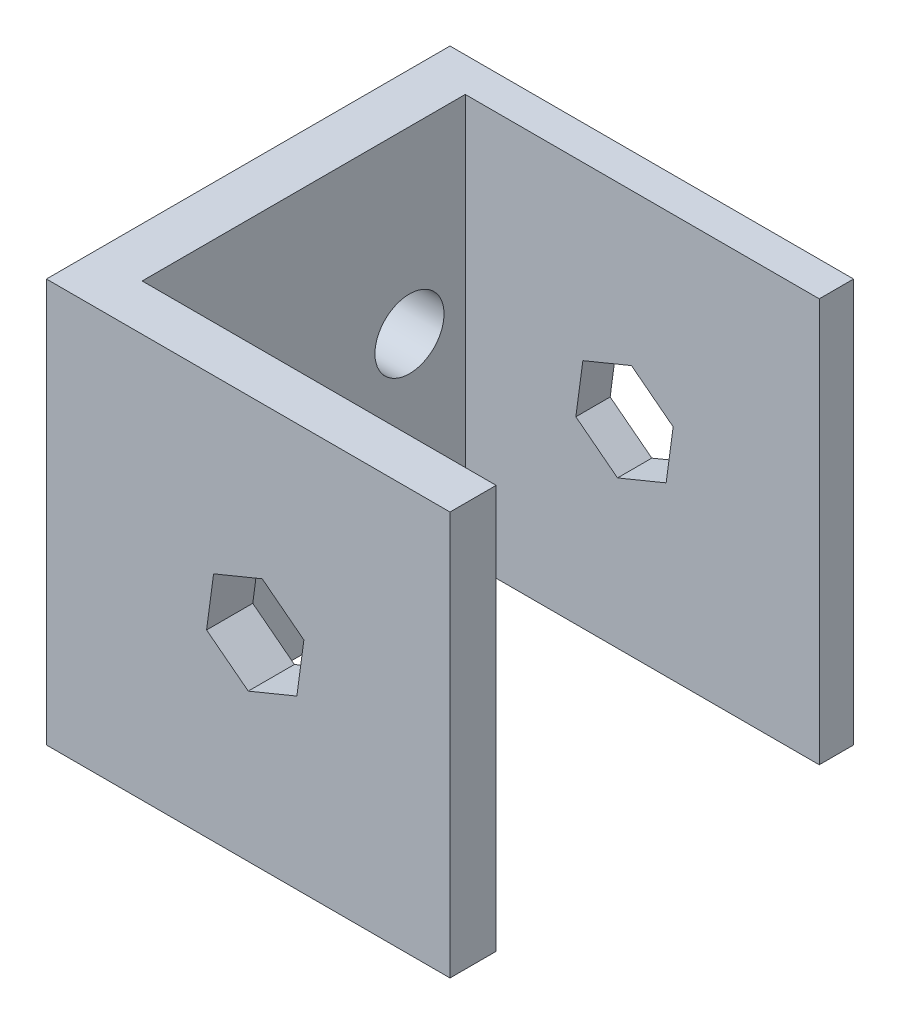
ISO-10303-21;
HEADER;
FILE_DESCRIPTION(('STEP AP214'),'2;1');
FILE_NAME('part.step','',(''),(''),'','','');
FILE_SCHEMA(('AUTOMOTIVE_DESIGN { 1 0 10303 214 1 1 1 1 }'));
ENDSEC;
DATA;
#1=APPLICATION_CONTEXT('core data for automotive mechanical design processes');
#2=APPLICATION_PROTOCOL_DEFINITION('international standard','automotive_design',2000,#1);
#3=PRODUCT_CONTEXT('',#1,'mechanical');
#4=PRODUCT('Part','Part','',(#3));
#5=PRODUCT_RELATED_PRODUCT_CATEGORY('part','',(#4));
#6=PRODUCT_DEFINITION_FORMATION('','',#4);
#7=PRODUCT_DEFINITION_CONTEXT('part definition',#1,'design');
#8=PRODUCT_DEFINITION('design','',#6,#7);
#9=PRODUCT_DEFINITION_SHAPE('','',#8);
#10=(LENGTH_UNIT() NAMED_UNIT(*) SI_UNIT(.MILLI.,.METRE.));
#11=(NAMED_UNIT(*) PLANE_ANGLE_UNIT() SI_UNIT($,.RADIAN.));
#12=(NAMED_UNIT(*) SI_UNIT($,.STERADIAN.) SOLID_ANGLE_UNIT());
#13=UNCERTAINTY_MEASURE_WITH_UNIT(LENGTH_MEASURE(1.E-05),#10,'distance_accuracy_value','');
#14=(GEOMETRIC_REPRESENTATION_CONTEXT(3) GLOBAL_UNCERTAINTY_ASSIGNED_CONTEXT((#13)) GLOBAL_UNIT_ASSIGNED_CONTEXT((#10,
#11,#12)) REPRESENTATION_CONTEXT('',''));
#15=CARTESIAN_POINT('',(0.,0.,0.));
#16=DIRECTION('',(0.,0.,1.));
#17=DIRECTION('',(1.,0.,0.));
#18=AXIS2_PLACEMENT_3D('',#15,#16,#17);
#19=CARTESIAN_POINT('',(0.,100.,0.));
#20=DIRECTION('',(1.,0.,0.));
#21=DIRECTION('',(0.,0.,-1.));
#22=AXIS2_PLACEMENT_3D('',#19,#20,#21);
#23=PLANE('',#22);
#24=CARTESIAN_POINT('',(0.,55.5405643466038,-22.3210604743485));
#25=DIRECTION('',(-1.,0.,0.));
#26=DIRECTION('',(0.,0.,1.));
#27=AXIS2_PLACEMENT_3D('',#24,#25,#26);
#28=CIRCLE('',#27,8.56179105414634);
#29=CARTESIAN_POINT('',(0.,55.5405643466038,-13.7592694202021));
#30=VERTEX_POINT('',#29);
#31=EDGE_CURVE('E332',#30,#30,#28,.T.);
#32=ORIENTED_EDGE('',*,*,#31,.F.);
#33=EDGE_LOOP('',(#32));
#34=FACE_BOUND('',#33,.T.);
#35=DIRECTION('',(0.,0.,1.));
#36=VECTOR('',#35,1.);
#37=CARTESIAN_POINT('',(0.,0.,0.));
#38=LINE('',#37,#36);
#39=CARTESIAN_POINT('',(0.,0.,-100.));
#40=VERTEX_POINT('',#39);
#41=CARTESIAN_POINT('',(0.,0.,0.));
#42=VERTEX_POINT('',#41);
#43=EDGE_CURVE('E272',#40,#42,#38,.T.);
#44=ORIENTED_EDGE('',*,*,#43,.T.);
#45=DIRECTION('',(0.,-1.,0.));
#46=VECTOR('',#45,1.);
#47=CARTESIAN_POINT('',(0.,100.,0.));
#48=LINE('',#47,#46);
#49=CARTESIAN_POINT('',(0.,100.,0.));
#50=VERTEX_POINT('',#49);
#51=EDGE_CURVE('E309',#50,#42,#48,.T.);
#52=ORIENTED_EDGE('',*,*,#51,.F.);
#53=DIRECTION('',(0.,0.,1.));
#54=VECTOR('',#53,1.);
#55=CARTESIAN_POINT('',(0.,100.,0.));
#56=LINE('',#55,#54);
#57=CARTESIAN_POINT('',(0.,100.,-100.));
#58=VERTEX_POINT('',#57);
#59=EDGE_CURVE('E279',#58,#50,#56,.T.);
#60=ORIENTED_EDGE('',*,*,#59,.F.);
#61=DIRECTION('',(0.,-1.,0.));
#62=VECTOR('',#61,1.);
#63=CARTESIAN_POINT('',(0.,100.,-100.));
#64=LINE('',#63,#62);
#65=EDGE_CURVE('E291',#58,#40,#64,.T.);
#66=ORIENTED_EDGE('',*,*,#65,.T.);
#67=EDGE_LOOP('',(#44,#52,#60,#66));
#68=FACE_BOUND('',#67,.T.);
#69=CARTESIAN_POINT('',(0.,55.5405643466038,-77.6789395256516));
#70=DIRECTION('',(-1.,0.,0.));
#71=DIRECTION('',(0.,0.,1.));
#72=AXIS2_PLACEMENT_3D('',#69,#70,#71);
#73=CIRCLE('',#72,8.56179105414634);
#74=CARTESIAN_POINT('',(0.,55.5405643466038,-69.1171484715052));
#75=VERTEX_POINT('',#74);
#76=EDGE_CURVE('E327',#75,#75,#73,.F.);
#77=ORIENTED_EDGE('',*,*,#76,.T.);
#78=EDGE_LOOP('',(#77));
#79=FACE_BOUND('',#78,.T.);
#80=ADVANCED_FACE('F33',(#34,#68,#79),#23,.F.);
#81=CARTESIAN_POINT('',(12.2824612319583,0.,-11.438127000658));
#82=DIRECTION('',(-1.,0.,0.));
#83=DIRECTION('',(0.,0.,1.));
#84=AXIS2_PLACEMENT_3D('',#81,#82,#83);
#85=PLANE('',#84);
#86=CARTESIAN_POINT('',(12.2824612319583,55.5405643466038,-22.3210604743485));
#87=DIRECTION('',(-1.,0.,0.));
#88=DIRECTION('',(0.,0.,1.));
#89=AXIS2_PLACEMENT_3D('',#86,#87,#88);
#90=CIRCLE('',#89,8.56179105414634);
#91=CARTESIAN_POINT('',(12.2824612319583,55.5405643466038,-13.7592694202021));
#92=VERTEX_POINT('',#91);
#93=EDGE_CURVE('E325',#92,#92,#90,.T.);
#94=ORIENTED_EDGE('',*,*,#93,.T.);
#95=EDGE_LOOP('',(#94));
#96=FACE_BOUND('',#95,.T.);
#97=DIRECTION('',(0.,0.,1.));
#98=VECTOR('',#97,1.);
#99=CARTESIAN_POINT('',(12.2824612319583,100.,-11.438127000658));
#100=LINE('',#99,#98);
#101=CARTESIAN_POINT('',(12.2824612319583,100.,-91.4994783761607));
#102=VERTEX_POINT('',#101);
#103=CARTESIAN_POINT('',(12.2824612319583,100.,-11.438127000658));
#104=VERTEX_POINT('',#103);
#105=EDGE_CURVE('E252',#102,#104,#100,.T.);
#106=ORIENTED_EDGE('',*,*,#105,.T.);
#107=DIRECTION('',(0.,1.,0.));
#108=VECTOR('',#107,1.);
#109=CARTESIAN_POINT('',(12.2824612319583,0.,-11.438127000658));
#110=LINE('',#109,#108);
#111=CARTESIAN_POINT('',(12.2824612319583,0.,-11.438127000658));
#112=VERTEX_POINT('',#111);
#113=EDGE_CURVE('E263',#112,#104,#110,.T.);
#114=ORIENTED_EDGE('',*,*,#113,.F.);
#115=DIRECTION('',(0.,0.,1.));
#116=VECTOR('',#115,1.);
#117=CARTESIAN_POINT('',(12.2824612319583,0.,-11.438127000658));
#118=LINE('',#117,#116);
#119=CARTESIAN_POINT('',(12.2824612319583,0.,-91.4994783761607));
#120=VERTEX_POINT('',#119);
#121=EDGE_CURVE('E253',#120,#112,#118,.T.);
#122=ORIENTED_EDGE('',*,*,#121,.F.);
#123=DIRECTION('',(0.,1.,0.));
#124=VECTOR('',#123,1.);
#125=CARTESIAN_POINT('',(12.2824612319583,0.,-91.4994783761607));
#126=LINE('',#125,#124);
#127=EDGE_CURVE('E270',#120,#102,#126,.T.);
#128=ORIENTED_EDGE('',*,*,#127,.T.);
#129=EDGE_LOOP('',(#106,#114,#122,#128));
#130=FACE_BOUND('',#129,.T.);
#131=CARTESIAN_POINT('',(12.2824612319583,55.5405643466038,-77.6789395256516));
#132=DIRECTION('',(-1.,0.,0.));
#133=DIRECTION('',(0.,0.,1.));
#134=AXIS2_PLACEMENT_3D('',#131,#132,#133);
#135=CIRCLE('',#134,8.56179105414634);
#136=CARTESIAN_POINT('',(12.2824612319583,55.5405643466038,-69.1171484715052));
#137=VERTEX_POINT('',#136);
#138=EDGE_CURVE('E36',#137,#137,#135,.F.);
#139=ORIENTED_EDGE('',*,*,#138,.F.);
#140=EDGE_LOOP('',(#139));
#141=FACE_BOUND('',#140,.T.);
#142=ADVANCED_FACE('F345',(#96,#130,#141),#85,.F.);
#143=CARTESIAN_POINT('',(100.,100.,0.));
#144=DIRECTION('',(-1.,0.,0.));
#145=DIRECTION('',(0.,0.,1.));
#146=AXIS2_PLACEMENT_3D('',#143,#144,#145);
#147=PLANE('',#146);
#148=DIRECTION('',(0.,0.,-1.));
#149=VECTOR('',#148,1.);
#150=CARTESIAN_POINT('',(100.,100.,0.));
#151=LINE('',#150,#149);
#152=CARTESIAN_POINT('',(100.,100.,-91.4994783761607));
#153=VERTEX_POINT('',#152);
#154=CARTESIAN_POINT('',(100.,100.,-100.));
#155=VERTEX_POINT('',#154);
#156=EDGE_CURVE('E285',#153,#155,#151,.T.);
#157=ORIENTED_EDGE('',*,*,#156,.F.);
#158=DIRECTION('',(0.,1.,0.));
#159=VECTOR('',#158,1.);
#160=CARTESIAN_POINT('',(100.,0.,-91.4994783761607));
#161=LINE('',#160,#159);
#162=CARTESIAN_POINT('',(100.,0.,-91.4994783761607));
#163=VERTEX_POINT('',#162);
#164=EDGE_CURVE('E273',#163,#153,#161,.T.);
#165=ORIENTED_EDGE('',*,*,#164,.F.);
#166=DIRECTION('',(0.,0.,-1.));
#167=VECTOR('',#166,1.);
#168=CARTESIAN_POINT('',(100.,0.,0.));
#169=LINE('',#168,#167);
#170=CARTESIAN_POINT('',(100.,0.,-100.));
#171=VERTEX_POINT('',#170);
#172=EDGE_CURVE('E296',#163,#171,#169,.T.);
#173=ORIENTED_EDGE('',*,*,#172,.T.);
#174=DIRECTION('',(0.,-1.,0.));
#175=VECTOR('',#174,1.);
#176=CARTESIAN_POINT('',(100.,100.,-100.));
#177=LINE('',#176,#175);
#178=EDGE_CURVE('E303',#155,#171,#177,.T.);
#179=ORIENTED_EDGE('',*,*,#178,.F.);
#180=EDGE_LOOP('',(#157,#165,#173,#179));
#181=FACE_BOUND('',#180,.T.);
#182=ADVANCED_FACE('F367',(#181),#147,.F.);
#183=CARTESIAN_POINT('',(0.,100.,0.));
#184=DIRECTION('',(0.,0.,-1.));
#185=DIRECTION('',(-1.,0.,0.));
#186=AXIS2_PLACEMENT_3D('',#183,#184,#185);
#187=PLANE('',#186);
#188=DIRECTION('',(-0.92474219122438,-0.380594114207684,0.));
#189=VECTOR('',#188,1.);
#190=CARTESIAN_POINT('',(29.5686627879516,28.1560355313738,0.));
#191=LINE('',#190,#189);
#192=CARTESIAN_POINT('',(62.0592826698266,41.5281286524071,0.));
#193=VERTEX_POINT('',#192);
#194=CARTESIAN_POINT('',(50.007786746489,36.568120923391,0.));
#195=VERTEX_POINT('',#194);
#196=EDGE_CURVE('E243',#193,#195,#191,.T.);
#197=ORIENTED_EDGE('',*,*,#196,.T.);
#198=DIRECTION('',(-0.791975267046881,0.610553172447758,0.));
#199=VECTOR('',#198,1.);
#200=CARTESIAN_POINT('',(-12.0303803274629,84.3948666513018,0.));
#201=LINE('',#200,#199);
#202=CARTESIAN_POINT('',(39.6865460885252,44.5250186820979,0.));
#203=VERTEX_POINT('',#202);
#204=EDGE_CURVE('E249',#195,#203,#201,.T.);
#205=ORIENTED_EDGE('',*,*,#204,.T.);
#206=DIRECTION('',(0.132766924177499,0.991147286655443,0.));
#207=VECTOR('',#206,1.);
#208=CARTESIAN_POINT('',(46.2870293685941,93.7997242172564,0.));
#209=LINE('',#208,#207);
#210=CARTESIAN_POINT('',(41.4168013538989,57.4419241698209,0.));
#211=VERTEX_POINT('',#210);
#212=EDGE_CURVE('E221',#203,#211,#209,.T.);
#213=ORIENTED_EDGE('',*,*,#212,.T.);
#214=DIRECTION('',(0.92474219122438,0.380594114207685,0.));
#215=VECTOR('',#214,1.);
#216=CARTESIAN_POINT('',(20.9776773953615,49.0298387778036,0.));
#217=LINE('',#216,#215);
#218=CARTESIAN_POINT('',(53.4682972772364,62.4019318988369,0.));
#219=VERTEX_POINT('',#218);
#220=EDGE_CURVE('E225',#211,#219,#217,.T.);
#221=ORIENTED_EDGE('',*,*,#220,.T.);
#222=DIRECTION('',(0.791975267046881,-0.610553172447758,0.));
#223=VECTOR('',#222,1.);
#224=CARTESIAN_POINT('',(1.75137086124833,102.271779868041,0.));
#225=LINE('',#224,#223);
#226=CARTESIAN_POINT('',(63.7895379352003,54.44503414013,0.));
#227=VERTEX_POINT('',#226);
#228=EDGE_CURVE('E231',#219,#227,#225,.T.);
#229=ORIENTED_EDGE('',*,*,#228,.T.);
#230=DIRECTION('',(-0.1327669241775,-0.991147286655443,0.));
#231=VECTOR('',#230,1.);
#232=CARTESIAN_POINT('',(68.6597659498956,90.8028341875655,0.));
#233=LINE('',#232,#231);
#234=EDGE_CURVE('E237',#227,#193,#233,.T.);
#235=ORIENTED_EDGE('',*,*,#234,.T.);
#236=EDGE_LOOP('',(#197,#205,#213,#221,#229,#235));
#237=FACE_BOUND('',#236,.T.);
#238=DIRECTION('',(1.,0.,0.));
#239=VECTOR('',#238,1.);
#240=CARTESIAN_POINT('',(0.,0.,0.));
#241=LINE('',#240,#239);
#242=CARTESIAN_POINT('',(100.,0.,0.));
#243=VERTEX_POINT('',#242);
#244=EDGE_CURVE('E294',#42,#243,#241,.T.);
#245=ORIENTED_EDGE('',*,*,#244,.T.);
#246=DIRECTION('',(0.,-1.,0.));
#247=VECTOR('',#246,1.);
#248=CARTESIAN_POINT('',(100.,100.,0.));
#249=LINE('',#248,#247);
#250=CARTESIAN_POINT('',(100.,100.,0.));
#251=VERTEX_POINT('',#250);
#252=EDGE_CURVE('E306',#251,#243,#249,.T.);
#253=ORIENTED_EDGE('',*,*,#252,.F.);
#254=DIRECTION('',(1.,0.,0.));
#255=VECTOR('',#254,1.);
#256=CARTESIAN_POINT('',(0.,100.,0.));
#257=LINE('',#256,#255);
#258=EDGE_CURVE('E282',#50,#251,#257,.T.);
#259=ORIENTED_EDGE('',*,*,#258,.F.);
#260=ORIENTED_EDGE('',*,*,#51,.T.);
#261=EDGE_LOOP('',(#245,#253,#259,#260));
#262=FACE_BOUND('',#261,.T.);
#263=ADVANCED_FACE('F357',(#237,#262),#187,.F.);
#264=CARTESIAN_POINT('',(100.,0.,-11.438127000658));
#265=VERTEX_POINT('',#264);
#266=EDGE_CURVE('E297',#243,#265,#169,.T.);
#267=ORIENTED_EDGE('',*,*,#266,.T.);
#268=DIRECTION('',(0.,1.,0.));
#269=VECTOR('',#268,1.);
#270=CARTESIAN_POINT('',(100.,0.,-11.438127000658));
#271=LINE('',#270,#269);
#272=CARTESIAN_POINT('',(100.,100.,-11.438127000658));
#273=VERTEX_POINT('',#272);
#274=EDGE_CURVE('E275',#265,#273,#271,.T.);
#275=ORIENTED_EDGE('',*,*,#274,.T.);
#276=EDGE_CURVE('E286',#251,#273,#151,.T.);
#277=ORIENTED_EDGE('',*,*,#276,.F.);
#278=ORIENTED_EDGE('',*,*,#252,.T.);
#279=EDGE_LOOP('',(#267,#275,#277,#278));
#280=FACE_BOUND('',#279,.T.);
#281=ADVANCED_FACE('F379',(#280),#147,.F.);
#282=CARTESIAN_POINT('',(0.,100.,-100.));
#283=DIRECTION('',(0.,0.,1.));
#284=DIRECTION('',(1.,0.,0.));
#285=AXIS2_PLACEMENT_3D('',#282,#283,#284);
#286=PLANE('',#285);
#287=DIRECTION('',(0.132766924177499,0.991147286655442,0.));
#288=VECTOR('',#287,1.);
#289=CARTESIAN_POINT('',(39.6865460885252,44.5250186820979,-100.));
#290=LINE('',#289,#288);
#291=CARTESIAN_POINT('',(39.6865460885252,44.5250186820979,-100.));
#292=VERTEX_POINT('',#291);
#293=CARTESIAN_POINT('',(41.4168013538989,57.4419241698209,-100.));
#294=VERTEX_POINT('',#293);
#295=EDGE_CURVE('E186',#292,#294,#290,.T.);
#296=ORIENTED_EDGE('',*,*,#295,.F.);
#297=DIRECTION('',(-0.791975267046881,0.610553172447758,0.));
#298=VECTOR('',#297,1.);
#299=CARTESIAN_POINT('',(50.007786746489,36.568120923391,-100.));
#300=LINE('',#299,#298);
#301=CARTESIAN_POINT('',(50.007786746489,36.568120923391,-100.));
#302=VERTEX_POINT('',#301);
#303=EDGE_CURVE('E57',#302,#292,#300,.T.);
#304=ORIENTED_EDGE('',*,*,#303,.F.);
#305=DIRECTION('',(-0.92474219122438,-0.380594114207684,0.));
#306=VECTOR('',#305,1.);
#307=CARTESIAN_POINT('',(62.0592826698266,41.5281286524071,-100.));
#308=LINE('',#307,#306);
#309=CARTESIAN_POINT('',(62.0592826698266,41.5281286524071,-100.));
#310=VERTEX_POINT('',#309);
#311=EDGE_CURVE('E203',#310,#302,#308,.T.);
#312=ORIENTED_EDGE('',*,*,#311,.F.);
#313=DIRECTION('',(-0.1327669241775,-0.991147286655442,0.));
#314=VECTOR('',#313,1.);
#315=CARTESIAN_POINT('',(63.7895379352003,54.44503414013,-100.));
#316=LINE('',#315,#314);
#317=CARTESIAN_POINT('',(63.7895379352003,54.44503414013,-100.));
#318=VERTEX_POINT('',#317);
#319=EDGE_CURVE('E197',#318,#310,#316,.T.);
#320=ORIENTED_EDGE('',*,*,#319,.F.);
#321=DIRECTION('',(0.791975267046881,-0.610553172447758,0.));
#322=VECTOR('',#321,1.);
#323=CARTESIAN_POINT('',(53.4682972772364,62.4019318988369,-100.));
#324=LINE('',#323,#322);
#325=CARTESIAN_POINT('',(53.4682972772364,62.4019318988369,-100.));
#326=VERTEX_POINT('',#325);
#327=EDGE_CURVE('E195',#326,#318,#324,.T.);
#328=ORIENTED_EDGE('',*,*,#327,.F.);
#329=DIRECTION('',(0.92474219122438,0.380594114207685,0.));
#330=VECTOR('',#329,1.);
#331=CARTESIAN_POINT('',(41.4168013538989,57.4419241698209,-100.));
#332=LINE('',#331,#330);
#333=EDGE_CURVE('E177',#294,#326,#332,.T.);
#334=ORIENTED_EDGE('',*,*,#333,.F.);
#335=EDGE_LOOP('',(#296,#304,#312,#320,#328,#334));
#336=FACE_BOUND('',#335,.T.);
#337=DIRECTION('',(-1.,0.,0.));
#338=VECTOR('',#337,1.);
#339=CARTESIAN_POINT('',(0.,0.,-100.));
#340=LINE('',#339,#338);
#341=EDGE_CURVE('E283',#171,#40,#340,.T.);
#342=ORIENTED_EDGE('',*,*,#341,.T.);
#343=ORIENTED_EDGE('',*,*,#65,.F.);
#344=DIRECTION('',(-1.,0.,0.));
#345=VECTOR('',#344,1.);
#346=CARTESIAN_POINT('',(0.,100.,-100.));
#347=LINE('',#346,#345);
#348=EDGE_CURVE('E289',#155,#58,#347,.T.);
#349=ORIENTED_EDGE('',*,*,#348,.F.);
#350=ORIENTED_EDGE('',*,*,#178,.T.);
#351=EDGE_LOOP('',(#342,#343,#349,#350));
#352=FACE_BOUND('',#351,.T.);
#353=ADVANCED_FACE('F191',(#336,#352),#286,.F.);
#354=CARTESIAN_POINT('',(0.,100.,0.));
#355=DIRECTION('',(0.,-1.,0.));
#356=DIRECTION('',(0.,0.,-1.));
#357=AXIS2_PLACEMENT_3D('',#354,#355,#356);
#358=PLANE('',#357);
#359=ORIENTED_EDGE('',*,*,#105,.F.);
#360=DIRECTION('',(-1.,0.,0.));
#361=VECTOR('',#360,1.);
#362=CARTESIAN_POINT('',(12.2824612319583,100.,-91.4994783761607));
#363=LINE('',#362,#361);
#364=EDGE_CURVE('E257',#153,#102,#363,.T.);
#365=ORIENTED_EDGE('',*,*,#364,.F.);
#366=ORIENTED_EDGE('',*,*,#156,.T.);
#367=ORIENTED_EDGE('',*,*,#348,.T.);
#368=ORIENTED_EDGE('',*,*,#59,.T.);
#369=ORIENTED_EDGE('',*,*,#258,.T.);
#370=ORIENTED_EDGE('',*,*,#276,.T.);
#371=DIRECTION('',(1.,0.,0.));
#372=VECTOR('',#371,1.);
#373=CARTESIAN_POINT('',(12.2824612319583,100.,-11.438127000658));
#374=LINE('',#373,#372);
#375=EDGE_CURVE('E266',#104,#273,#374,.T.);
#376=ORIENTED_EDGE('',*,*,#375,.F.);
#377=EDGE_LOOP('',(#359,#365,#366,#367,#368,#369,#370,#376));
#378=FACE_BOUND('',#377,.T.);
#379=ADVANCED_FACE('F361',(#378),#358,.F.);
#380=CARTESIAN_POINT('',(0.,0.,0.));
#381=DIRECTION('',(0.,-1.,0.));
#382=DIRECTION('',(0.,0.,-1.));
#383=AXIS2_PLACEMENT_3D('',#380,#381,#382);
#384=PLANE('',#383);
#385=DIRECTION('',(-1.,0.,0.));
#386=VECTOR('',#385,1.);
#387=CARTESIAN_POINT('',(12.2824612319583,0.,-91.4994783761607));
#388=LINE('',#387,#386);
#389=EDGE_CURVE('E260',#163,#120,#388,.T.);
#390=ORIENTED_EDGE('',*,*,#389,.T.);
#391=ORIENTED_EDGE('',*,*,#121,.T.);
#392=DIRECTION('',(1.,0.,0.));
#393=VECTOR('',#392,1.);
#394=CARTESIAN_POINT('',(12.2824612319583,0.,-11.438127000658));
#395=LINE('',#394,#393);
#396=EDGE_CURVE('E256',#112,#265,#395,.T.);
#397=ORIENTED_EDGE('',*,*,#396,.T.);
#398=ORIENTED_EDGE('',*,*,#266,.F.);
#399=ORIENTED_EDGE('',*,*,#244,.F.);
#400=ORIENTED_EDGE('',*,*,#43,.F.);
#401=ORIENTED_EDGE('',*,*,#341,.F.);
#402=ORIENTED_EDGE('',*,*,#172,.F.);
#403=EDGE_LOOP('',(#390,#391,#397,#398,#399,#400,#401,#402));
#404=FACE_BOUND('',#403,.T.);
#405=ADVANCED_FACE('F352',(#404),#384,.T.);
#406=CARTESIAN_POINT('',(12.2824612319583,0.,-91.4994783761607));
#407=DIRECTION('',(0.,0.,-1.));
#408=DIRECTION('',(-1.,0.,0.));
#409=AXIS2_PLACEMENT_3D('',#406,#407,#408);
#410=PLANE('',#409);
#411=DIRECTION('',(-0.92474219122438,-0.380594114207684,0.));
#412=VECTOR('',#411,1.);
#413=CARTESIAN_POINT('',(4.87684290831273,17.9936774120538,-91.4994783761607));
#414=LINE('',#413,#412);
#415=CARTESIAN_POINT('',(62.0592826698266,41.5281286524071,-91.4994783761607));
#416=VERTEX_POINT('',#415);
#417=CARTESIAN_POINT('',(50.007786746489,36.568120923391,-91.4994783761607));
#418=VERTEX_POINT('',#417);
#419=EDGE_CURVE('E240',#416,#418,#414,.T.);
#420=ORIENTED_EDGE('',*,*,#419,.T.);
#421=DIRECTION('',(-0.791975267046881,0.610553172447758,0.));
#422=VECTOR('',#421,1.);
#423=CARTESIAN_POINT('',(44.027785431861,41.1782507163354,-91.4994783761607));
#424=LINE('',#423,#422);
#425=CARTESIAN_POINT('',(39.6865460885252,44.5250186820979,-91.4994783761607));
#426=VERTEX_POINT('',#425);
#427=EDGE_CURVE('E246',#418,#426,#424,.T.);
#428=ORIENTED_EDGE('',*,*,#427,.T.);
#429=DIRECTION('',(0.132766924177499,0.991147286655443,0.));
#430=VECTOR('',#429,1.);
#431=CARTESIAN_POINT('',(33.3443753368465,-2.82130172845724,-91.4994783761607));
#432=LINE('',#431,#430);
#433=CARTESIAN_POINT('',(41.4168013538989,57.4419241698209,-91.4994783761607));
#434=VERTEX_POINT('',#433);
#435=EDGE_CURVE('E219',#426,#434,#432,.T.);
#436=ORIENTED_EDGE('',*,*,#435,.T.);
#437=DIRECTION('',(0.92474219122438,0.380594114207685,0.));
#438=VECTOR('',#437,1.);
#439=CARTESIAN_POINT('',(-3.71414248427743,38.8674806584836,-91.4994783761607));
#440=LINE('',#439,#438);
#441=CARTESIAN_POINT('',(53.4682972772364,62.4019318988369,-91.4994783761607));
#442=VERTEX_POINT('',#441);
#443=EDGE_CURVE('E180',#434,#442,#440,.T.);
#444=ORIENTED_EDGE('',*,*,#443,.T.);
#445=DIRECTION('',(0.791975267046881,-0.610553172447758,0.));
#446=VECTOR('',#445,1.);
#447=CARTESIAN_POINT('',(57.8095366205723,59.0551639330744,-91.4994783761607));
#448=LINE('',#447,#446);
#449=CARTESIAN_POINT('',(63.7895379352003,54.44503414013,-91.4994783761607));
#450=VERTEX_POINT('',#449);
#451=EDGE_CURVE('E228',#442,#450,#448,.T.);
#452=ORIENTED_EDGE('',*,*,#451,.T.);
#453=DIRECTION('',(-0.1327669241775,-0.991147286655443,0.));
#454=VECTOR('',#453,1.);
#455=CARTESIAN_POINT('',(55.7171119181479,-5.81819175814808,-91.4994783761607));
#456=LINE('',#455,#454);
#457=EDGE_CURVE('E234',#450,#416,#456,.T.);
#458=ORIENTED_EDGE('',*,*,#457,.T.);
#459=EDGE_LOOP('',(#420,#428,#436,#444,#452,#458));
#460=FACE_BOUND('',#459,.T.);
#461=ORIENTED_EDGE('',*,*,#364,.T.);
#462=ORIENTED_EDGE('',*,*,#127,.F.);
#463=ORIENTED_EDGE('',*,*,#389,.F.);
#464=ORIENTED_EDGE('',*,*,#164,.T.);
#465=EDGE_LOOP('',(#461,#462,#463,#464));
#466=FACE_BOUND('',#465,.T.);
#467=ADVANCED_FACE('F371',(#460,#466),#410,.F.);
#468=CARTESIAN_POINT('',(12.2824612319583,0.,-11.438127000658));
#469=DIRECTION('',(0.,0.,1.));
#470=DIRECTION('',(1.,0.,0.));
#471=AXIS2_PLACEMENT_3D('',#468,#469,#470);
#472=PLANE('',#471);
#473=DIRECTION('',(-0.132766924177499,-0.991147286655443,0.));
#474=VECTOR('',#473,1.);
#475=CARTESIAN_POINT('',(33.3443753368465,-2.82130172845724,-11.438127000658));
#476=LINE('',#475,#474);
#477=CARTESIAN_POINT('',(41.4168013538989,57.4419241698209,-11.438127000658));
#478=VERTEX_POINT('',#477);
#479=CARTESIAN_POINT('',(39.6865460885252,44.5250186820979,-11.438127000658));
#480=VERTEX_POINT('',#479);
#481=EDGE_CURVE('E312',#478,#480,#476,.T.);
#482=ORIENTED_EDGE('',*,*,#481,.T.);
#483=DIRECTION('',(0.791975267046881,-0.610553172447758,0.));
#484=VECTOR('',#483,1.);
#485=CARTESIAN_POINT('',(44.027785431861,41.1782507163354,-11.438127000658));
#486=LINE('',#485,#484);
#487=CARTESIAN_POINT('',(50.007786746489,36.568120923391,-11.438127000658));
#488=VERTEX_POINT('',#487);
#489=EDGE_CURVE('E11',#480,#488,#486,.T.);
#490=ORIENTED_EDGE('',*,*,#489,.T.);
#491=DIRECTION('',(0.92474219122438,0.380594114207684,0.));
#492=VECTOR('',#491,1.);
#493=CARTESIAN_POINT('',(4.87684290831273,17.9936774120538,-11.438127000658));
#494=LINE('',#493,#492);
#495=CARTESIAN_POINT('',(62.0592826698266,41.5281286524071,-11.438127000658));
#496=VERTEX_POINT('',#495);
#497=EDGE_CURVE('E41',#488,#496,#494,.T.);
#498=ORIENTED_EDGE('',*,*,#497,.T.);
#499=DIRECTION('',(0.1327669241775,0.991147286655443,0.));
#500=VECTOR('',#499,1.);
#501=CARTESIAN_POINT('',(55.7171119181479,-5.81819175814808,-11.438127000658));
#502=LINE('',#501,#500);
#503=CARTESIAN_POINT('',(63.7895379352003,54.44503414013,-11.438127000658));
#504=VERTEX_POINT('',#503);
#505=EDGE_CURVE('E321',#496,#504,#502,.T.);
#506=ORIENTED_EDGE('',*,*,#505,.T.);
#507=DIRECTION('',(-0.791975267046881,0.610553172447758,0.));
#508=VECTOR('',#507,1.);
#509=CARTESIAN_POINT('',(57.8095366205723,59.0551639330744,-11.438127000658));
#510=LINE('',#509,#508);
#511=CARTESIAN_POINT('',(53.4682972772364,62.4019318988369,-11.438127000658));
#512=VERTEX_POINT('',#511);
#513=EDGE_CURVE('E318',#504,#512,#510,.T.);
#514=ORIENTED_EDGE('',*,*,#513,.T.);
#515=DIRECTION('',(-0.92474219122438,-0.380594114207685,0.));
#516=VECTOR('',#515,1.);
#517=CARTESIAN_POINT('',(-3.71414248427743,38.8674806584836,-11.438127000658));
#518=LINE('',#517,#516);
#519=EDGE_CURVE('E315',#512,#478,#518,.T.);
#520=ORIENTED_EDGE('',*,*,#519,.T.);
#521=EDGE_LOOP('',(#482,#490,#498,#506,#514,#520));
#522=FACE_BOUND('',#521,.T.);
#523=ORIENTED_EDGE('',*,*,#375,.T.);
#524=ORIENTED_EDGE('',*,*,#274,.F.);
#525=ORIENTED_EDGE('',*,*,#396,.F.);
#526=ORIENTED_EDGE('',*,*,#113,.T.);
#527=EDGE_LOOP('',(#523,#524,#525,#526));
#528=FACE_BOUND('',#527,.T.);
#529=ADVANCED_FACE('F377',(#522,#528),#472,.F.);
#530=CARTESIAN_POINT('',(39.6865460885252,44.5250186820979,9.99999999999999));
#531=DIRECTION('',(-0.991147286655443,0.132766924177499,0.));
#532=DIRECTION('',(-0.132766924177499,-0.991147286655443,0.));
#533=AXIS2_PLACEMENT_3D('',#530,#531,#532);
#534=PLANE('',#533);
#535=DIRECTION('',(0.,0.,-1.));
#536=VECTOR('',#535,1.);
#537=CARTESIAN_POINT('',(39.6865460885252,44.5250186820979,9.99999999999999));
#538=LINE('',#537,#536);
#539=EDGE_CURVE('E183',#203,#480,#538,.T.);
#540=ORIENTED_EDGE('',*,*,#539,.T.);
#541=ORIENTED_EDGE('',*,*,#481,.F.);
#542=DIRECTION('',(0.,0.,-1.));
#543=VECTOR('',#542,1.);
#544=CARTESIAN_POINT('',(41.4168013538989,57.4419241698209,9.99999999999999));
#545=LINE('',#544,#543);
#546=EDGE_CURVE('E49',#211,#478,#545,.T.);
#547=ORIENTED_EDGE('',*,*,#546,.F.);
#548=ORIENTED_EDGE('',*,*,#212,.F.);
#549=EDGE_LOOP('',(#540,#541,#547,#548));
#550=FACE_BOUND('',#549,.T.);
#551=ADVANCED_FACE('F408',(#550),#534,.F.);
#552=CARTESIAN_POINT('',(41.4168013538989,57.4419241698209,9.99999999999999));
#553=DIRECTION('',(-0.380594114207685,0.92474219122438,0.));
#554=DIRECTION('',(-0.92474219122438,-0.380594114207685,0.));
#555=AXIS2_PLACEMENT_3D('',#552,#553,#554);
#556=PLANE('',#555);
#557=ORIENTED_EDGE('',*,*,#546,.T.);
#558=ORIENTED_EDGE('',*,*,#519,.F.);
#559=DIRECTION('',(0.,0.,-1.));
#560=VECTOR('',#559,1.);
#561=CARTESIAN_POINT('',(53.4682972772364,62.4019318988369,9.99999999999999));
#562=LINE('',#561,#560);
#563=EDGE_CURVE('E215',#219,#512,#562,.T.);
#564=ORIENTED_EDGE('',*,*,#563,.F.);
#565=ORIENTED_EDGE('',*,*,#220,.F.);
#566=EDGE_LOOP('',(#557,#558,#564,#565));
#567=FACE_BOUND('',#566,.T.);
#568=ADVANCED_FACE('F419',(#567),#556,.F.);
#569=CARTESIAN_POINT('',(53.4682972772364,62.4019318988369,9.99999999999999));
#570=DIRECTION('',(0.610553172447758,0.791975267046881,0.));
#571=DIRECTION('',(-0.791975267046881,0.610553172447758,0.));
#572=AXIS2_PLACEMENT_3D('',#569,#570,#571);
#573=PLANE('',#572);
#574=ORIENTED_EDGE('',*,*,#563,.T.);
#575=ORIENTED_EDGE('',*,*,#513,.F.);
#576=DIRECTION('',(0.,0.,-1.));
#577=VECTOR('',#576,1.);
#578=CARTESIAN_POINT('',(63.7895379352003,54.44503414013,9.99999999999999));
#579=LINE('',#578,#577);
#580=EDGE_CURVE('E212',#227,#504,#579,.T.);
#581=ORIENTED_EDGE('',*,*,#580,.F.);
#582=ORIENTED_EDGE('',*,*,#228,.F.);
#583=EDGE_LOOP('',(#574,#575,#581,#582));
#584=FACE_BOUND('',#583,.T.);
#585=ADVANCED_FACE('F422',(#584),#573,.F.);
#586=CARTESIAN_POINT('',(63.7895379352003,54.44503414013,9.99999999999999));
#587=DIRECTION('',(0.991147286655443,-0.1327669241775,0.));
#588=DIRECTION('',(0.1327669241775,0.991147286655443,0.));
#589=AXIS2_PLACEMENT_3D('',#586,#587,#588);
#590=PLANE('',#589);
#591=ORIENTED_EDGE('',*,*,#580,.T.);
#592=ORIENTED_EDGE('',*,*,#505,.F.);
#593=DIRECTION('',(0.,0.,-1.));
#594=VECTOR('',#593,1.);
#595=CARTESIAN_POINT('',(62.0592826698266,41.5281286524071,9.99999999999999));
#596=LINE('',#595,#594);
#597=EDGE_CURVE('E209',#193,#496,#596,.T.);
#598=ORIENTED_EDGE('',*,*,#597,.F.);
#599=ORIENTED_EDGE('',*,*,#234,.F.);
#600=EDGE_LOOP('',(#591,#592,#598,#599));
#601=FACE_BOUND('',#600,.T.);
#602=ADVANCED_FACE('F426',(#601),#590,.F.);
#603=CARTESIAN_POINT('',(62.0592826698266,41.5281286524071,9.99999999999999));
#604=DIRECTION('',(0.380594114207684,-0.92474219122438,0.));
#605=DIRECTION('',(0.92474219122438,0.380594114207684,0.));
#606=AXIS2_PLACEMENT_3D('',#603,#604,#605);
#607=PLANE('',#606);
#608=ORIENTED_EDGE('',*,*,#597,.T.);
#609=ORIENTED_EDGE('',*,*,#497,.F.);
#610=DIRECTION('',(0.,0.,-1.));
#611=VECTOR('',#610,1.);
#612=CARTESIAN_POINT('',(50.007786746489,36.568120923391,9.99999999999999));
#613=LINE('',#612,#611);
#614=EDGE_CURVE('E208',#195,#488,#613,.T.);
#615=ORIENTED_EDGE('',*,*,#614,.F.);
#616=ORIENTED_EDGE('',*,*,#196,.F.);
#617=EDGE_LOOP('',(#608,#609,#615,#616));
#618=FACE_BOUND('',#617,.T.);
#619=ADVANCED_FACE('F415',(#618),#607,.F.);
#620=CARTESIAN_POINT('',(50.007786746489,36.568120923391,9.99999999999999));
#621=DIRECTION('',(-0.610553172447758,-0.791975267046881,0.));
#622=DIRECTION('',(0.791975267046881,-0.610553172447758,0.));
#623=AXIS2_PLACEMENT_3D('',#620,#621,#622);
#624=PLANE('',#623);
#625=ORIENTED_EDGE('',*,*,#614,.T.);
#626=ORIENTED_EDGE('',*,*,#489,.F.);
#627=ORIENTED_EDGE('',*,*,#539,.F.);
#628=ORIENTED_EDGE('',*,*,#204,.F.);
#629=EDGE_LOOP('',(#625,#626,#627,#628));
#630=FACE_BOUND('',#629,.T.);
#631=ADVANCED_FACE('F411',(#630),#624,.F.);
#632=EDGE_CURVE('E206',#418,#302,#613,.T.);
#633=ORIENTED_EDGE('',*,*,#632,.T.);
#634=ORIENTED_EDGE('',*,*,#303,.T.);
#635=EDGE_CURVE('E188',#426,#292,#538,.T.);
#636=ORIENTED_EDGE('',*,*,#635,.F.);
#637=ORIENTED_EDGE('',*,*,#427,.F.);
#638=EDGE_LOOP('',(#633,#634,#636,#637));
#639=FACE_BOUND('',#638,.T.);
#640=ADVANCED_FACE('F414',(#639),#624,.F.);
#641=EDGE_CURVE('E210',#416,#310,#596,.T.);
#642=ORIENTED_EDGE('',*,*,#641,.T.);
#643=ORIENTED_EDGE('',*,*,#311,.T.);
#644=ORIENTED_EDGE('',*,*,#632,.F.);
#645=ORIENTED_EDGE('',*,*,#419,.F.);
#646=EDGE_LOOP('',(#642,#643,#644,#645));
#647=FACE_BOUND('',#646,.T.);
#648=ADVANCED_FACE('F436',(#647),#607,.F.);
#649=EDGE_CURVE('E213',#450,#318,#579,.T.);
#650=ORIENTED_EDGE('',*,*,#649,.T.);
#651=ORIENTED_EDGE('',*,*,#319,.T.);
#652=ORIENTED_EDGE('',*,*,#641,.F.);
#653=ORIENTED_EDGE('',*,*,#457,.F.);
#654=EDGE_LOOP('',(#650,#651,#652,#653));
#655=FACE_BOUND('',#654,.T.);
#656=ADVANCED_FACE('F432',(#655),#590,.F.);
#657=EDGE_CURVE('E216',#442,#326,#562,.T.);
#658=ORIENTED_EDGE('',*,*,#657,.T.);
#659=ORIENTED_EDGE('',*,*,#327,.T.);
#660=ORIENTED_EDGE('',*,*,#649,.F.);
#661=ORIENTED_EDGE('',*,*,#451,.F.);
#662=EDGE_LOOP('',(#658,#659,#660,#661));
#663=FACE_BOUND('',#662,.T.);
#664=ADVANCED_FACE('F428',(#663),#573,.F.);
#665=EDGE_CURVE('E172',#434,#294,#545,.T.);
#666=ORIENTED_EDGE('',*,*,#665,.T.);
#667=ORIENTED_EDGE('',*,*,#333,.T.);
#668=ORIENTED_EDGE('',*,*,#657,.F.);
#669=ORIENTED_EDGE('',*,*,#443,.F.);
#670=EDGE_LOOP('',(#666,#667,#668,#669));
#671=FACE_BOUND('',#670,.T.);
#672=ADVANCED_FACE('F174',(#671),#556,.F.);
#673=ORIENTED_EDGE('',*,*,#635,.T.);
#674=ORIENTED_EDGE('',*,*,#295,.T.);
#675=ORIENTED_EDGE('',*,*,#665,.F.);
#676=ORIENTED_EDGE('',*,*,#435,.F.);
#677=EDGE_LOOP('',(#673,#674,#675,#676));
#678=FACE_BOUND('',#677,.T.);
#679=ADVANCED_FACE('F187',(#678),#534,.F.);
#680=CARTESIAN_POINT('',(110.,55.5405643466038,-22.3210604743485));
#681=DIRECTION('',(-1.,0.,0.));
#682=DIRECTION('',(0.,0.,1.));
#683=AXIS2_PLACEMENT_3D('',#680,#681,#682);
#684=CYLINDRICAL_SURFACE('',#683,8.56179105414634);
#685=ORIENTED_EDGE('',*,*,#31,.T.);
#686=EDGE_LOOP('',(#685));
#687=FACE_BOUND('',#686,.T.);
#688=ORIENTED_EDGE('',*,*,#93,.F.);
#689=EDGE_LOOP('',(#688));
#690=FACE_BOUND('',#689,.T.);
#691=ADVANCED_FACE('F340',(#687,#690),#684,.F.);
#692=CARTESIAN_POINT('',(110.,55.5405643466038,-77.6789395256516));
#693=DIRECTION('',(-1.,0.,0.));
#694=DIRECTION('',(0.,0.,1.));
#695=AXIS2_PLACEMENT_3D('',#692,#693,#694);
#696=CYLINDRICAL_SURFACE('',#695,8.56179105414634);
#697=ORIENTED_EDGE('',*,*,#76,.F.);
#698=EDGE_LOOP('',(#697));
#699=FACE_BOUND('',#698,.T.);
#700=ORIENTED_EDGE('',*,*,#138,.T.);
#701=EDGE_LOOP('',(#700));
#702=FACE_BOUND('',#701,.T.);
#703=ADVANCED_FACE('F439',(#699,#702),#696,.F.);
#704=CLOSED_SHELL('',(#80,#142,#182,#263,#281,#353,#379,#405,#467,#529,#551,#568,#585,#602,#619,
#631,#640,#648,#656,#664,#672,#679,#691,#703));
#705=MANIFOLD_SOLID_BREP('B2',#704);
#706=ADVANCED_BREP_SHAPE_REPRESENTATION('',(#18,#705),#14);
#707=SHAPE_DEFINITION_REPRESENTATION(#9,#706);
ENDSEC;
END-ISO-10303-21;
